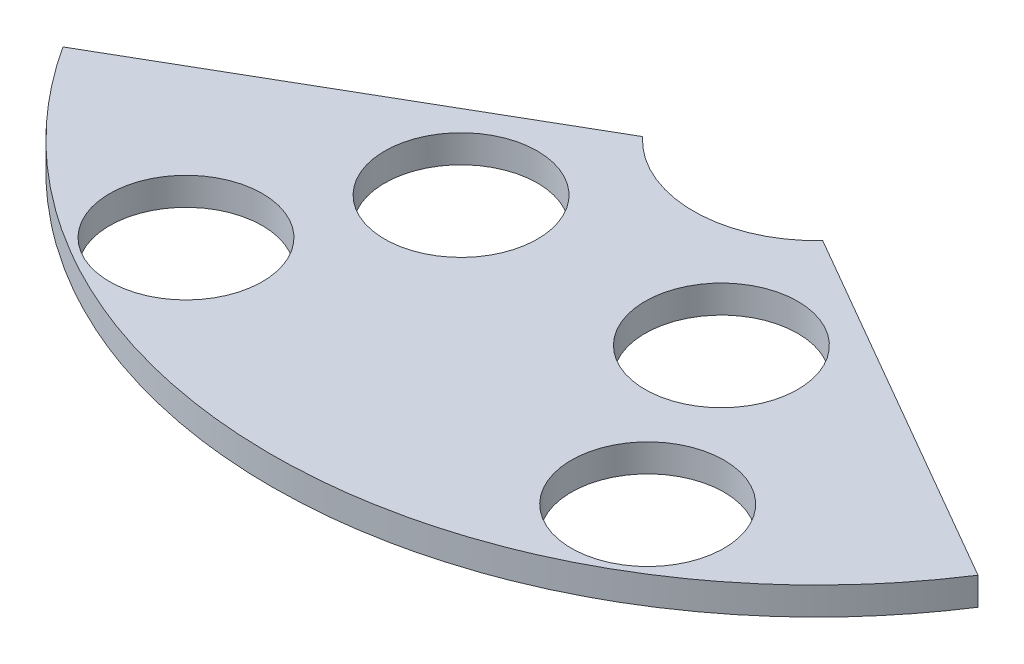
ISO-10303-21;
HEADER;
FILE_DESCRIPTION(('STEP AP214'),'2;1');
FILE_NAME('part.step','',(''),(''),'','','');
FILE_SCHEMA(('AUTOMOTIVE_DESIGN { 1 0 10303 214 1 1 1 1 }'));
ENDSEC;
DATA;
#1=APPLICATION_CONTEXT('core data for automotive mechanical design processes');
#2=APPLICATION_PROTOCOL_DEFINITION('international standard','automotive_design',2000,#1);
#3=PRODUCT_CONTEXT('',#1,'mechanical');
#4=PRODUCT('Part','Part','',(#3));
#5=PRODUCT_RELATED_PRODUCT_CATEGORY('part','',(#4));
#6=PRODUCT_DEFINITION_FORMATION('','',#4);
#7=PRODUCT_DEFINITION_CONTEXT('part definition',#1,'design');
#8=PRODUCT_DEFINITION('design','',#6,#7);
#9=PRODUCT_DEFINITION_SHAPE('','',#8);
#10=(LENGTH_UNIT() NAMED_UNIT(*) SI_UNIT(.MILLI.,.METRE.));
#11=(NAMED_UNIT(*) PLANE_ANGLE_UNIT() SI_UNIT($,.RADIAN.));
#12=(NAMED_UNIT(*) SI_UNIT($,.STERADIAN.) SOLID_ANGLE_UNIT());
#13=UNCERTAINTY_MEASURE_WITH_UNIT(LENGTH_MEASURE(1.E-05),#10,'distance_accuracy_value','');
#14=(GEOMETRIC_REPRESENTATION_CONTEXT(3) GLOBAL_UNCERTAINTY_ASSIGNED_CONTEXT((#13)) GLOBAL_UNIT_ASSIGNED_CONTEXT((#10,
#11,#12)) REPRESENTATION_CONTEXT('',''));
#15=CARTESIAN_POINT('',(0.,0.,0.));
#16=DIRECTION('',(0.,0.,1.));
#17=DIRECTION('',(1.,0.,0.));
#18=AXIS2_PLACEMENT_3D('',#15,#16,#17);
#19=CARTESIAN_POINT('',(0.000616258628515492,-11.7359999999999,78.4993851096615));
#20=DIRECTION('',(0.,-1.,0.));
#21=DIRECTION('',(0.,0.,-1.));
#22=AXIS2_PLACEMENT_3D('',#19,#20,#21);
#23=PLANE('',#22);
#24=CARTESIAN_POINT('',(18.75,-11.7359999999999,32.476));
#25=DIRECTION('',(0.,-1.,0.));
#26=DIRECTION('',(0.,0.,-1.));
#27=AXIS2_PLACEMENT_3D('',#24,#25,#26);
#28=CIRCLE('',#27,10.999845998306);
#29=CARTESIAN_POINT('',(18.75,-11.7359999999999,21.476154001694));
#30=VERTEX_POINT('',#29);
#31=EDGE_CURVE('E159',#30,#30,#28,.T.);
#32=ORIENTED_EDGE('',*,*,#31,.F.);
#33=EDGE_LOOP('',(#32));
#34=FACE_BOUND('',#33,.T.);
#35=CARTESIAN_POINT('',(-33.25,-11.7359999999999,57.591));
#36=DIRECTION('',(0.,-1.,0.));
#37=DIRECTION('',(0.,0.,-1.));
#38=AXIS2_PLACEMENT_3D('',#35,#36,#37);
#39=CIRCLE('',#38,10.999845998306);
#40=CARTESIAN_POINT('',(-33.25,-11.7359999999999,46.591154001694));
#41=VERTEX_POINT('',#40);
#42=EDGE_CURVE('E145',#41,#41,#39,.T.);
#43=ORIENTED_EDGE('',*,*,#42,.F.);
#44=EDGE_LOOP('',(#43));
#45=FACE_BOUND('',#44,.T.);
#46=CARTESIAN_POINT('',(-65.8942438215736,-11.7359999999999,42.6629141284689));
#47=CARTESIAN_POINT('',(-64.1224690254093,-11.7359999999999,45.3985002034109));
#48=CARTESIAN_POINT('',(-62.182117423227,-11.7359999999999,48.0242176634994));
#49=CARTESIAN_POINT('',(-57.9885817877531,-11.7359999999999,53.0111997196014));
#50=CARTESIAN_POINT('',(-55.735202360949,-11.7359999999999,55.3750226592089));
#51=CARTESIAN_POINT('',(-50.9543508950594,-11.7359999999999,59.8042284675522));
#52=CARTESIAN_POINT('',(-48.4265540785118,-11.7359999999999,61.8689579645787));
#53=CARTESIAN_POINT('',(-43.1321450523109,-11.7359999999999,65.6694084607403));
#54=CARTESIAN_POINT('',(-40.3663757418454,-11.7359999999999,67.4051630540775));
#55=CARTESIAN_POINT('',(-34.642176265318,-11.7359999999999,70.5183607739632));
#56=CARTESIAN_POINT('',(-31.6816988564251,-11.7359999999999,71.8962088023146));
#57=CARTESIAN_POINT('',(-25.6141936620369,-11.7359999999999,74.2754428396154));
#58=CARTESIAN_POINT('',(-22.5075089317522,-11.7359999999999,75.2748314307115));
#59=CARTESIAN_POINT('',(-16.1911688205888,-11.7359999999999,76.8807056911563));
#60=CARTESIAN_POINT('',(-12.9826876269583,-11.7359999999999,77.4872708349914));
#61=CARTESIAN_POINT('',(-6.51713373164389,-11.7359999999999,78.2964112052625));
#62=CARTESIAN_POINT('',(-3.25813511582603,-11.7359999999999,78.4991919373815));
#63=CARTESIAN_POINT('',(3.25936763308278,-11.7359999999999,78.4995782819415));
#64=CARTESIAN_POINT('',(6.51693377486242,-11.7359999999999,78.2969085645046));
#65=CARTESIAN_POINT('',(12.9833592632475,-11.7359999999999,77.4869872979339));
#66=CARTESIAN_POINT('',(16.1918865681666,-11.7359999999999,76.8809942061614));
#67=CARTESIAN_POINT('',(22.5075144955505,-11.7359999999999,75.2748193650567));
#68=CARTESIAN_POINT('',(25.6159652883001,-11.7359999999999,74.2747165026005));
#69=CARTESIAN_POINT('',(31.683303453992,-11.7359999999999,71.8968821392876));
#70=CARTESIAN_POINT('',(34.6405246931465,-11.7359999999999,70.5187169501518));
#71=CARTESIAN_POINT('',(38.9358044127406,-11.7359999999999,68.1819602112117));
#72=CARTESIAN_POINT('',(40.3438733017762,-11.7359999999999,67.3588679444615));
#73=CARTESIAN_POINT('',(43.1037131115859,-11.7359999999999,65.6278759827651));
#74=CARTESIAN_POINT('',(44.4555906372705,-11.7359999999999,64.7195269188699));
#75=CARTESIAN_POINT('',(48.425598828893,-11.7359999999999,61.8682213108461));
#76=CARTESIAN_POINT('',(50.9557926218356,-11.7359999999999,59.8027055628751));
#77=CARTESIAN_POINT('',(55.7368944253913,-11.7359999999999,55.3749447836234));
#78=CARTESIAN_POINT('',(57.9896042095914,-11.7359999999999,53.0117267869905));
#79=CARTESIAN_POINT('',(62.1825184719887,-11.7359999999999,48.024000086958));
#80=CARTESIAN_POINT('',(64.1237966907177,-11.7359999999999,45.3985301379076));
#81=CARTESIAN_POINT('',(65.8946490574842,-11.7359999999999,42.6631480920333));
#82=B_SPLINE_CURVE_WITH_KNOTS('',3,(#46,#47,#48,#49,#50,#51,#52,#53,#54,#55,#56,#57,#58,#59,#60,
#61,#62,#63,#64,#65,#66,#67,#68,#69,#70,#71,#72,#73,#74,#75,#76,#77,#78,#79,#80,#81),
.UNSPECIFIED.,.F.,.F.,(4,2,2,2,2,2,2,2,2,2,2,2,2,2,2,2,2,4),(0.,0.0624999999999998,0.125,
0.187499999999999,0.249999999999999,0.312499999999999,0.374999999999999,0.437499999999999,
0.499999999999999,0.562499999999999,0.624999999999999,0.687499999999999,0.749999999999999,
0.781249999999999,0.812499999999999,0.874999999999999,0.9375,1.),.UNSPECIFIED.);
#83=CARTESIAN_POINT('',(65.8946490574842,-11.7359999999999,42.6631480920333));
#84=VERTEX_POINT('',#83);
#85=CARTESIAN_POINT('',(-65.8942438215736,-11.7359999999999,42.6629141284689));
#86=VERTEX_POINT('',#85);
#87=EDGE_CURVE('E86',#84,#86,#82,.F.);
#88=ORIENTED_EDGE('',*,*,#87,.T.);
#89=DIRECTION('',(0.866025113443951,0.,-0.500000502884139));
#90=VECTOR('',#89,1.);
#91=CARTESIAN_POINT('',(-65.8942438215736,-11.7359999999999,42.6629141284689));
#92=LINE('',#91,#90);
#93=CARTESIAN_POINT('',(-12.9766531358799,-11.7359999999999,12.1108879302399));
#94=VERTEX_POINT('',#93);
#95=EDGE_CURVE('E81',#86,#94,#92,.T.);
#96=ORIENTED_EDGE('',*,*,#95,.T.);
#97=CARTESIAN_POINT('',(0.,-11.7359999999999,0.));
#98=DIRECTION('',(0.,1.,0.));
#99=DIRECTION('',(0.,0.,-1.));
#100=AXIS2_PLACEMENT_3D('',#97,#98,#99);
#101=CIRCLE('',#100,17.7501305084715);
#102=CARTESIAN_POINT('',(12.9766531358511,-11.7359999999999,12.1108879302707));
#103=VERTEX_POINT('',#102);
#104=EDGE_CURVE('E84',#94,#103,#101,.T.);
#105=ORIENTED_EDGE('',*,*,#104,.T.);
#106=DIRECTION('',(0.866025113442951,0.,0.500000502885871));
#107=VECTOR('',#106,1.);
#108=CARTESIAN_POINT('',(12.9766531358511,-11.7359999999999,12.1108879302707));
#109=LINE('',#108,#107);
#110=EDGE_CURVE('E51',#103,#84,#109,.T.);
#111=ORIENTED_EDGE('',*,*,#110,.T.);
#112=EDGE_LOOP('',(#88,#96,#105,#111));
#113=FACE_BOUND('',#112,.T.);
#114=CARTESIAN_POINT('',(33.25,-11.7359999999999,57.591));
#115=DIRECTION('',(0.,-1.,0.));
#116=DIRECTION('',(0.,0.,-1.));
#117=AXIS2_PLACEMENT_3D('',#114,#115,#116);
#118=CIRCLE('',#117,10.999845998306);
#119=CARTESIAN_POINT('',(33.25,-11.7359999999999,46.591154001694));
#120=VERTEX_POINT('',#119);
#121=EDGE_CURVE('E154',#120,#120,#118,.T.);
#122=ORIENTED_EDGE('',*,*,#121,.F.);
#123=EDGE_LOOP('',(#122));
#124=FACE_BOUND('',#123,.T.);
#125=CARTESIAN_POINT('',(-18.75,-11.7359999999999,32.476));
#126=DIRECTION('',(0.,-1.,0.));
#127=DIRECTION('',(0.,0.,-1.));
#128=AXIS2_PLACEMENT_3D('',#125,#126,#127);
#129=CIRCLE('',#128,10.999845998306);
#130=CARTESIAN_POINT('',(-18.75,-11.7359999999999,21.476154001694));
#131=VERTEX_POINT('',#130);
#132=EDGE_CURVE('E165',#131,#131,#129,.T.);
#133=ORIENTED_EDGE('',*,*,#132,.F.);
#134=EDGE_LOOP('',(#133));
#135=FACE_BOUND('',#134,.T.);
#136=ADVANCED_FACE('F30',(#34,#45,#113,#124,#135),#23,.T.);
#137=CARTESIAN_POINT('',(0.000616258628515492,-7.73599999999992,78.4993851096615));
#138=DIRECTION('',(0.,-1.,0.));
#139=DIRECTION('',(0.,0.,-1.));
#140=AXIS2_PLACEMENT_3D('',#137,#138,#139);
#141=PLANE('',#140);
#142=CARTESIAN_POINT('',(18.75,-7.73599999999992,32.476));
#143=DIRECTION('',(0.,-1.,0.));
#144=DIRECTION('',(0.,0.,-1.));
#145=AXIS2_PLACEMENT_3D('',#142,#143,#144);
#146=CIRCLE('',#145,10.999845998306);
#147=CARTESIAN_POINT('',(18.75,-7.73599999999992,21.476154001694));
#148=VERTEX_POINT('',#147);
#149=EDGE_CURVE('E162',#148,#148,#146,.T.);
#150=ORIENTED_EDGE('',*,*,#149,.T.);
#151=EDGE_LOOP('',(#150));
#152=FACE_BOUND('',#151,.T.);
#153=CARTESIAN_POINT('',(-33.25,-7.73599999999992,57.591));
#154=DIRECTION('',(0.,-1.,0.));
#155=DIRECTION('',(0.,0.,-1.));
#156=AXIS2_PLACEMENT_3D('',#153,#154,#155);
#157=CIRCLE('',#156,10.999845998306);
#158=CARTESIAN_POINT('',(-33.25,-7.73599999999992,46.591154001694));
#159=VERTEX_POINT('',#158);
#160=EDGE_CURVE('E149',#159,#159,#157,.T.);
#161=ORIENTED_EDGE('',*,*,#160,.T.);
#162=EDGE_LOOP('',(#161));
#163=FACE_BOUND('',#162,.T.);
#164=CARTESIAN_POINT('',(65.8946490574842,-7.73599999999992,42.6631480920333));
#165=CARTESIAN_POINT('',(64.1237966907177,-7.73599999999992,45.3985301379076));
#166=CARTESIAN_POINT('',(62.1825184719887,-7.73599999999992,48.024000086958));
#167=CARTESIAN_POINT('',(57.9896042095914,-7.73599999999992,53.0117267869905));
#168=CARTESIAN_POINT('',(55.7368944253913,-7.73599999999992,55.3749447836234));
#169=CARTESIAN_POINT('',(50.9557926218356,-7.73599999999992,59.8027055628751));
#170=CARTESIAN_POINT('',(48.425598828893,-7.73599999999992,61.8682213108461));
#171=CARTESIAN_POINT('',(44.4555906372705,-7.73599999999992,64.7195269188699));
#172=CARTESIAN_POINT('',(43.1037131115859,-7.73599999999992,65.6278759827651));
#173=CARTESIAN_POINT('',(40.3438733017762,-7.73599999999992,67.3588679444615));
#174=CARTESIAN_POINT('',(38.9358044127406,-7.73599999999992,68.1819602112117));
#175=CARTESIAN_POINT('',(34.6405246931465,-7.73599999999992,70.5187169501518));
#176=CARTESIAN_POINT('',(31.683303453992,-7.73599999999992,71.8968821392876));
#177=CARTESIAN_POINT('',(25.6159652883001,-7.73599999999992,74.2747165026005));
#178=CARTESIAN_POINT('',(22.5075144955505,-7.73599999999992,75.2748193650567));
#179=CARTESIAN_POINT('',(16.1918865681666,-7.73599999999992,76.8809942061614));
#180=CARTESIAN_POINT('',(12.9833592632475,-7.73599999999992,77.4869872979339));
#181=CARTESIAN_POINT('',(6.51693377486242,-7.73599999999992,78.2969085645046));
#182=CARTESIAN_POINT('',(3.25936763308278,-7.73599999999992,78.4995782819415));
#183=CARTESIAN_POINT('',(-3.25813511582603,-7.73599999999992,78.4991919373815));
#184=CARTESIAN_POINT('',(-6.51713373164389,-7.73599999999992,78.2964112052625));
#185=CARTESIAN_POINT('',(-12.9826876269583,-7.73599999999992,77.4872708349914));
#186=CARTESIAN_POINT('',(-16.1911688205888,-7.73599999999992,76.8807056911563));
#187=CARTESIAN_POINT('',(-22.5075089317522,-7.73599999999992,75.2748314307115));
#188=CARTESIAN_POINT('',(-25.6141936620369,-7.73599999999992,74.2754428396154));
#189=CARTESIAN_POINT('',(-31.6816988564251,-7.73599999999992,71.8962088023146));
#190=CARTESIAN_POINT('',(-34.642176265318,-7.73599999999992,70.5183607739632));
#191=CARTESIAN_POINT('',(-40.3663757418454,-7.73599999999992,67.4051630540775));
#192=CARTESIAN_POINT('',(-43.1321450523109,-7.73599999999992,65.6694084607403));
#193=CARTESIAN_POINT('',(-48.4265540785118,-7.73599999999992,61.8689579645787));
#194=CARTESIAN_POINT('',(-50.9543508950594,-7.73599999999992,59.8042284675522));
#195=CARTESIAN_POINT('',(-55.735202360949,-7.73599999999992,55.3750226592089));
#196=CARTESIAN_POINT('',(-57.9885817877531,-7.73599999999992,53.0111997196014));
#197=CARTESIAN_POINT('',(-62.182117423227,-7.73599999999992,48.0242176634994));
#198=CARTESIAN_POINT('',(-64.1224690254093,-7.73599999999992,45.3985002034109));
#199=CARTESIAN_POINT('',(-65.8942438215736,-7.73599999999992,42.6629141284689));
#200=B_SPLINE_CURVE_WITH_KNOTS('',3,(#164,#165,#166,#167,#168,#169,#170,#171,#172,#173,#174,
#175,#176,#177,#178,#179,#180,#181,#182,#183,#184,#185,#186,#187,#188,#189,#190,#191,#192,#193,
#194,#195,#196,#197,#198,#199),.UNSPECIFIED.,.F.,.F.,(4,2,2,2,2,2,2,2,2,2,2,2,2,2,2,2,2,4),(0.,
0.0625000000000003,0.125000000000001,0.187500000000001,0.218750000000001,0.250000000000001,
0.312500000000001,0.375000000000001,0.437500000000001,0.500000000000001,0.562500000000001,
0.625000000000001,0.687500000000001,0.750000000000001,0.812500000000001,0.875,0.9375,1.),.UNSPECIFIED.);
#201=CARTESIAN_POINT('',(65.8946490574842,-7.73599999999992,42.6631480920333));
#202=VERTEX_POINT('',#201);
#203=CARTESIAN_POINT('',(-65.8942438215736,-7.73599999999992,42.6629141284689));
#204=VERTEX_POINT('',#203);
#205=EDGE_CURVE('E143',#202,#204,#200,.T.);
#206=ORIENTED_EDGE('',*,*,#205,.F.);
#207=DIRECTION('',(0.866025113442951,0.,0.500000502885871));
#208=VECTOR('',#207,1.);
#209=CARTESIAN_POINT('',(12.9766531358511,-7.73599999999992,12.1108879302707));
#210=LINE('',#209,#208);
#211=CARTESIAN_POINT('',(12.9766531358511,-7.73599999999992,12.1108879302707));
#212=VERTEX_POINT('',#211);
#213=EDGE_CURVE('E74',#212,#202,#210,.T.);
#214=ORIENTED_EDGE('',*,*,#213,.F.);
#215=CARTESIAN_POINT('',(0.,-7.73599999999992,0.));
#216=DIRECTION('',(0.,1.,0.));
#217=DIRECTION('',(0.,0.,-1.));
#218=AXIS2_PLACEMENT_3D('',#215,#216,#217);
#219=CIRCLE('',#218,17.7501305084715);
#220=CARTESIAN_POINT('',(-12.9766531358799,-7.73599999999992,12.1108879302399));
#221=VERTEX_POINT('',#220);
#222=EDGE_CURVE('E68',#221,#212,#219,.T.);
#223=ORIENTED_EDGE('',*,*,#222,.F.);
#224=DIRECTION('',(0.866025113443951,0.,-0.500000502884139));
#225=VECTOR('',#224,1.);
#226=CARTESIAN_POINT('',(-65.8942438215736,-7.73599999999992,42.6629141284689));
#227=LINE('',#226,#225);
#228=EDGE_CURVE('E91',#204,#221,#227,.T.);
#229=ORIENTED_EDGE('',*,*,#228,.F.);
#230=EDGE_LOOP('',(#206,#214,#223,#229));
#231=FACE_BOUND('',#230,.T.);
#232=CARTESIAN_POINT('',(33.25,-7.73599999999992,57.591));
#233=DIRECTION('',(0.,-1.,0.));
#234=DIRECTION('',(0.,0.,-1.));
#235=AXIS2_PLACEMENT_3D('',#232,#233,#234);
#236=CIRCLE('',#235,10.999845998306);
#237=CARTESIAN_POINT('',(33.25,-7.73599999999992,46.591154001694));
#238=VERTEX_POINT('',#237);
#239=EDGE_CURVE('E156',#238,#238,#236,.T.);
#240=ORIENTED_EDGE('',*,*,#239,.T.);
#241=EDGE_LOOP('',(#240));
#242=FACE_BOUND('',#241,.T.);
#243=CARTESIAN_POINT('',(-18.75,-7.73599999999992,32.476));
#244=DIRECTION('',(0.,-1.,0.));
#245=DIRECTION('',(0.,0.,-1.));
#246=AXIS2_PLACEMENT_3D('',#243,#244,#245);
#247=CIRCLE('',#246,10.999845998306);
#248=CARTESIAN_POINT('',(-18.75,-7.73599999999992,21.476154001694));
#249=VERTEX_POINT('',#248);
#250=EDGE_CURVE('E168',#249,#249,#247,.T.);
#251=ORIENTED_EDGE('',*,*,#250,.T.);
#252=EDGE_LOOP('',(#251));
#253=FACE_BOUND('',#252,.T.);
#254=ADVANCED_FACE('F119',(#152,#163,#231,#242,#253),#141,.F.);
#255=CARTESIAN_POINT('',(65.8946490574842,-11.7359999999999,42.6631480920333));
#256=CARTESIAN_POINT('',(64.1237966907177,-11.7359999999999,45.3985301379076));
#257=CARTESIAN_POINT('',(62.1825184719887,-11.7359999999999,48.024000086958));
#258=CARTESIAN_POINT('',(57.9896042095914,-11.7359999999999,53.0117267869905));
#259=CARTESIAN_POINT('',(55.7368944253913,-11.7359999999999,55.3749447836234));
#260=CARTESIAN_POINT('',(50.9557926218356,-11.7359999999999,59.8027055628751));
#261=CARTESIAN_POINT('',(48.425598828893,-11.7359999999999,61.8682213108461));
#262=CARTESIAN_POINT('',(44.4555906372705,-11.7359999999999,64.7195269188699));
#263=CARTESIAN_POINT('',(43.1037131115859,-11.7359999999999,65.6278759827651));
#264=CARTESIAN_POINT('',(40.3438733017762,-11.7359999999999,67.3588679444615));
#265=CARTESIAN_POINT('',(38.9358044127406,-11.7359999999999,68.1819602112117));
#266=CARTESIAN_POINT('',(34.6405246931465,-11.7359999999999,70.5187169501518));
#267=CARTESIAN_POINT('',(31.683303453992,-11.7359999999999,71.8968821392876));
#268=CARTESIAN_POINT('',(25.6159652883001,-11.7359999999999,74.2747165026005));
#269=CARTESIAN_POINT('',(22.5075144955505,-11.7359999999999,75.2748193650567));
#270=CARTESIAN_POINT('',(16.1918865681666,-11.7359999999999,76.8809942061614));
#271=CARTESIAN_POINT('',(12.9833592632475,-11.7359999999999,77.4869872979339));
#272=CARTESIAN_POINT('',(6.51693377486242,-11.7359999999999,78.2969085645046));
#273=CARTESIAN_POINT('',(3.25936763308278,-11.7359999999999,78.4995782819415));
#274=CARTESIAN_POINT('',(-3.25813511582603,-11.7359999999999,78.4991919373815));
#275=CARTESIAN_POINT('',(-6.51713373164389,-11.7359999999999,78.2964112052625));
#276=CARTESIAN_POINT('',(-12.9826876269583,-11.7359999999999,77.4872708349914));
#277=CARTESIAN_POINT('',(-16.1911688205888,-11.7359999999999,76.8807056911563));
#278=CARTESIAN_POINT('',(-22.5075089317522,-11.7359999999999,75.2748314307115));
#279=CARTESIAN_POINT('',(-25.6141936620369,-11.7359999999999,74.2754428396154));
#280=CARTESIAN_POINT('',(-31.6816988564251,-11.7359999999999,71.8962088023146));
#281=CARTESIAN_POINT('',(-34.642176265318,-11.7359999999999,70.5183607739632));
#282=CARTESIAN_POINT('',(-40.3663757418454,-11.7359999999999,67.4051630540775));
#283=CARTESIAN_POINT('',(-43.1321450523109,-11.7359999999999,65.6694084607403));
#284=CARTESIAN_POINT('',(-48.4265540785118,-11.7359999999999,61.8689579645787));
#285=CARTESIAN_POINT('',(-50.9543508950594,-11.7359999999999,59.8042284675522));
#286=CARTESIAN_POINT('',(-55.735202360949,-11.7359999999999,55.3750226592089));
#287=CARTESIAN_POINT('',(-57.9885817877531,-11.7359999999999,53.0111997196014));
#288=CARTESIAN_POINT('',(-62.182117423227,-11.7359999999999,48.0242176634994));
#289=CARTESIAN_POINT('',(-64.1224690254093,-11.7359999999999,45.3985002034109));
#290=CARTESIAN_POINT('',(-65.8942438215736,-11.7359999999999,42.6629141284689));
#291=B_SPLINE_CURVE_WITH_KNOTS('',3,(#255,#256,#257,#258,#259,#260,#261,#262,#263,#264,#265,
#266,#267,#268,#269,#270,#271,#272,#273,#274,#275,#276,#277,#278,#279,#280,#281,#282,#283,#284,
#285,#286,#287,#288,#289,#290),.UNSPECIFIED.,.F.,.F.,(4,2,2,2,2,2,2,2,2,2,2,2,2,2,2,2,2,4),(0.,
0.0625000000000003,0.125000000000001,0.187500000000001,0.218750000000001,0.250000000000001,
0.312500000000001,0.375000000000001,0.437500000000001,0.500000000000001,0.562500000000001,
0.625000000000001,0.687500000000001,0.750000000000001,0.812500000000001,0.875,0.9375,1.),.UNSPECIFIED.);
#292=DIRECTION('',(0.,1.,0.));
#293=VECTOR('',#292,1.);
#294=SURFACE_OF_LINEAR_EXTRUSION('',#291,#293);
#295=ORIENTED_EDGE('',*,*,#205,.T.);
#296=DIRECTION('',(0.,1.,0.));
#297=VECTOR('',#296,1.);
#298=CARTESIAN_POINT('',(-65.8942438215736,-11.7359999999999,42.6629141284689));
#299=LINE('',#298,#297);
#300=EDGE_CURVE('E11',#86,#204,#299,.T.);
#301=ORIENTED_EDGE('',*,*,#300,.F.);
#302=ORIENTED_EDGE('',*,*,#87,.F.);
#303=DIRECTION('',(0.,1.,0.));
#304=VECTOR('',#303,1.);
#305=CARTESIAN_POINT('',(65.8946490574842,-11.7359999999999,42.6631480920333));
#306=LINE('',#305,#304);
#307=EDGE_CURVE('E96',#84,#202,#306,.T.);
#308=ORIENTED_EDGE('',*,*,#307,.T.);
#309=EDGE_LOOP('',(#295,#301,#302,#308));
#310=FACE_BOUND('',#309,.T.);
#311=ADVANCED_FACE('F32',(#310),#294,.F.);
#312=CARTESIAN_POINT('',(-65.8942438215736,-11.7359999999999,42.6629141284689));
#313=DIRECTION('',(0.500000502884139,0.,0.866025113443951));
#314=DIRECTION('',(0.866025113443951,0.,-0.500000502884139));
#315=AXIS2_PLACEMENT_3D('',#312,#313,#314);
#316=PLANE('',#315);
#317=ORIENTED_EDGE('',*,*,#228,.T.);
#318=DIRECTION('',(0.,1.,0.));
#319=VECTOR('',#318,1.);
#320=CARTESIAN_POINT('',(-12.9766531358799,-11.7359999999999,12.1108879302399));
#321=LINE('',#320,#319);
#322=EDGE_CURVE('E42',#94,#221,#321,.T.);
#323=ORIENTED_EDGE('',*,*,#322,.F.);
#324=ORIENTED_EDGE('',*,*,#95,.F.);
#325=ORIENTED_EDGE('',*,*,#300,.T.);
#326=EDGE_LOOP('',(#317,#323,#324,#325));
#327=FACE_BOUND('',#326,.T.);
#328=ADVANCED_FACE('F90',(#327),#316,.F.);
#329=CARTESIAN_POINT('',(0.,-11.7359999999999,0.));
#330=DIRECTION('',(0.,1.,0.));
#331=DIRECTION('',(0.,0.,1.));
#332=AXIS2_PLACEMENT_3D('',#329,#330,#331);
#333=CYLINDRICAL_SURFACE('',#332,17.7501305084715);
#334=ORIENTED_EDGE('',*,*,#222,.T.);
#335=DIRECTION('',(0.,1.,0.));
#336=VECTOR('',#335,1.);
#337=CARTESIAN_POINT('',(12.9766531358511,-11.7359999999999,12.1108879302707));
#338=LINE('',#337,#336);
#339=EDGE_CURVE('E92',#103,#212,#338,.T.);
#340=ORIENTED_EDGE('',*,*,#339,.F.);
#341=ORIENTED_EDGE('',*,*,#104,.F.);
#342=ORIENTED_EDGE('',*,*,#322,.T.);
#343=EDGE_LOOP('',(#334,#340,#341,#342));
#344=FACE_BOUND('',#343,.T.);
#345=ADVANCED_FACE('F94',(#344),#333,.F.);
#346=CARTESIAN_POINT('',(12.9766531358511,-11.7359999999999,12.1108879302707));
#347=DIRECTION('',(-0.500000502885871,0.,0.866025113442951));
#348=DIRECTION('',(0.866025113442951,0.,0.500000502885871));
#349=AXIS2_PLACEMENT_3D('',#346,#347,#348);
#350=PLANE('',#349);
#351=ORIENTED_EDGE('',*,*,#213,.T.);
#352=ORIENTED_EDGE('',*,*,#307,.F.);
#353=ORIENTED_EDGE('',*,*,#110,.F.);
#354=ORIENTED_EDGE('',*,*,#339,.T.);
#355=EDGE_LOOP('',(#351,#352,#353,#354));
#356=FACE_BOUND('',#355,.T.);
#357=ADVANCED_FACE('F127',(#356),#350,.F.);
#358=CARTESIAN_POINT('',(-33.25,-11.7359999999999,57.591));
#359=DIRECTION('',(0.,1.,0.));
#360=DIRECTION('',(0.,0.,1.));
#361=AXIS2_PLACEMENT_3D('',#358,#359,#360);
#362=CYLINDRICAL_SURFACE('',#361,10.999845998306);
#363=ORIENTED_EDGE('',*,*,#42,.T.);
#364=EDGE_LOOP('',(#363));
#365=FACE_BOUND('',#364,.T.);
#366=ORIENTED_EDGE('',*,*,#160,.F.);
#367=EDGE_LOOP('',(#366));
#368=FACE_BOUND('',#367,.T.);
#369=ADVANCED_FACE('F121',(#365,#368),#362,.F.);
#370=CARTESIAN_POINT('',(33.25,-11.7359999999999,57.591));
#371=DIRECTION('',(0.,1.,0.));
#372=DIRECTION('',(0.,0.,1.));
#373=AXIS2_PLACEMENT_3D('',#370,#371,#372);
#374=CYLINDRICAL_SURFACE('',#373,10.999845998306);
#375=ORIENTED_EDGE('',*,*,#121,.T.);
#376=EDGE_LOOP('',(#375));
#377=FACE_BOUND('',#376,.T.);
#378=ORIENTED_EDGE('',*,*,#239,.F.);
#379=EDGE_LOOP('',(#378));
#380=FACE_BOUND('',#379,.T.);
#381=ADVANCED_FACE('F185',(#377,#380),#374,.F.);
#382=CARTESIAN_POINT('',(18.75,-11.7359999999999,32.476));
#383=DIRECTION('',(0.,1.,0.));
#384=DIRECTION('',(0.,0.,1.));
#385=AXIS2_PLACEMENT_3D('',#382,#383,#384);
#386=CYLINDRICAL_SURFACE('',#385,10.999845998306);
#387=ORIENTED_EDGE('',*,*,#31,.T.);
#388=EDGE_LOOP('',(#387));
#389=FACE_BOUND('',#388,.T.);
#390=ORIENTED_EDGE('',*,*,#149,.F.);
#391=EDGE_LOOP('',(#390));
#392=FACE_BOUND('',#391,.T.);
#393=ADVANCED_FACE('F178',(#389,#392),#386,.F.);
#394=CARTESIAN_POINT('',(-18.75,-11.7359999999999,32.476));
#395=DIRECTION('',(0.,1.,0.));
#396=DIRECTION('',(0.,0.,1.));
#397=AXIS2_PLACEMENT_3D('',#394,#395,#396);
#398=CYLINDRICAL_SURFACE('',#397,10.999845998306);
#399=ORIENTED_EDGE('',*,*,#132,.T.);
#400=EDGE_LOOP('',(#399));
#401=FACE_BOUND('',#400,.T.);
#402=ORIENTED_EDGE('',*,*,#250,.F.);
#403=EDGE_LOOP('',(#402));
#404=FACE_BOUND('',#403,.T.);
#405=ADVANCED_FACE('F174',(#401,#404),#398,.F.);
#406=CLOSED_SHELL('',(#136,#254,#311,#328,#345,#357,#369,#381,#393,#405));
#407=MANIFOLD_SOLID_BREP('B2',#406);
#408=ADVANCED_BREP_SHAPE_REPRESENTATION('',(#18,#407),#14);
#409=SHAPE_DEFINITION_REPRESENTATION(#9,#408);
ENDSEC;
END-ISO-10303-21;
